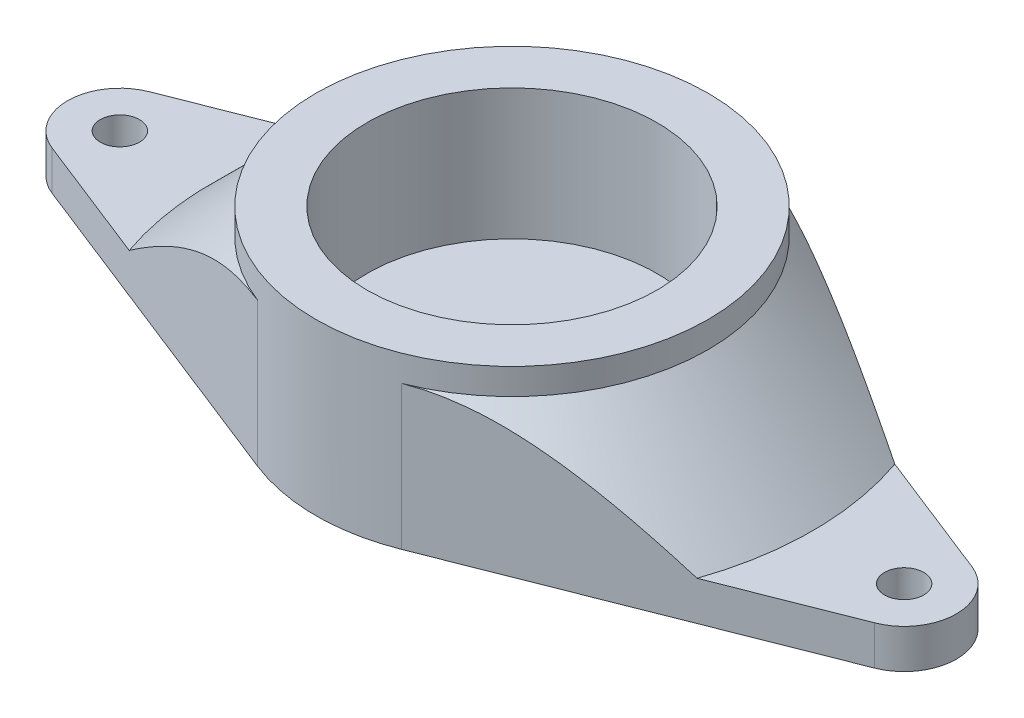
ISO-10303-21;
HEADER;
FILE_DESCRIPTION(('STEP AP214'),'2;1');
FILE_NAME('part.step','',(''),(''),'','','');
FILE_SCHEMA(('AUTOMOTIVE_DESIGN { 1 0 10303 214 1 1 1 1 }'));
ENDSEC;
DATA;
#1=APPLICATION_CONTEXT('core data for automotive mechanical design processes');
#2=APPLICATION_PROTOCOL_DEFINITION('international standard','automotive_design',2000,#1);
#3=PRODUCT_CONTEXT('',#1,'mechanical');
#4=PRODUCT('Part','Part','',(#3));
#5=PRODUCT_RELATED_PRODUCT_CATEGORY('part','',(#4));
#6=PRODUCT_DEFINITION_FORMATION('','',#4);
#7=PRODUCT_DEFINITION_CONTEXT('part definition',#1,'design');
#8=PRODUCT_DEFINITION('design','',#6,#7);
#9=PRODUCT_DEFINITION_SHAPE('','',#8);
#10=(LENGTH_UNIT() NAMED_UNIT(*) SI_UNIT(.MILLI.,.METRE.));
#11=(NAMED_UNIT(*) PLANE_ANGLE_UNIT() SI_UNIT($,.RADIAN.));
#12=(NAMED_UNIT(*) SI_UNIT($,.STERADIAN.) SOLID_ANGLE_UNIT());
#13=UNCERTAINTY_MEASURE_WITH_UNIT(LENGTH_MEASURE(1.E-05),#10,'distance_accuracy_value','');
#14=(GEOMETRIC_REPRESENTATION_CONTEXT(3) GLOBAL_UNCERTAINTY_ASSIGNED_CONTEXT((#13)) GLOBAL_UNIT_ASSIGNED_CONTEXT((#10,
#11,#12)) REPRESENTATION_CONTEXT('',''));
#15=CARTESIAN_POINT('',(0.,0.,0.));
#16=DIRECTION('',(0.,0.,1.));
#17=DIRECTION('',(1.,0.,0.));
#18=AXIS2_PLACEMENT_3D('',#15,#16,#17);
#19=CARTESIAN_POINT('',(0.,3.,0.));
#20=DIRECTION('',(0.,1.,0.));
#21=DIRECTION('',(0.,0.,1.));
#22=AXIS2_PLACEMENT_3D('',#19,#20,#21);
#23=PLANE('',#22);
#24=DIRECTION('',(-0.930352382463524,0.,-0.366666666666667));
#25=VECTOR('',#24,1.);
#26=CARTESIAN_POINT('',(5.5,3.,-13.9552857369529));
#27=LINE('',#26,#25);
#28=CARTESIAN_POINT('',(31.4666666666667,3.,-3.7214095298541));
#29=VERTEX_POINT('',#28);
#30=CARTESIAN_POINT('',(21.7212480681632,3.,-7.56223395309323));
#31=VERTEX_POINT('',#30);
#32=EDGE_CURVE('E155',#29,#31,#27,.T.);
#33=ORIENTED_EDGE('',*,*,#32,.T.);
#34=CARTESIAN_POINT('',(0.,3.,0.));
#35=DIRECTION('',(0.,1.,0.));
#36=DIRECTION('',(0.,0.,1.));
#37=AXIS2_PLACEMENT_3D('',#34,#35,#36);
#38=CIRCLE('',#37,23.);
#39=CARTESIAN_POINT('',(21.7212480681632,3.,7.56223395309322));
#40=VERTEX_POINT('',#39);
#41=EDGE_CURVE('E159',#31,#40,#38,.F.);
#42=ORIENTED_EDGE('',*,*,#41,.T.);
#43=DIRECTION('',(-0.930352382463524,0.,0.366666666666667));
#44=VECTOR('',#43,1.);
#45=CARTESIAN_POINT('',(5.5,3.,13.9552857369529));
#46=LINE('',#45,#44);
#47=CARTESIAN_POINT('',(31.4666666666667,3.,3.7214095298541));
#48=VERTEX_POINT('',#47);
#49=EDGE_CURVE('E139',#48,#40,#46,.T.);
#50=ORIENTED_EDGE('',*,*,#49,.F.);
#51=CARTESIAN_POINT('',(30.,3.,0.));
#52=DIRECTION('',(0.,1.,0.));
#53=DIRECTION('',(0.,0.,1.));
#54=AXIS2_PLACEMENT_3D('',#51,#52,#53);
#55=CIRCLE('',#54,4.00000000000001);
#56=EDGE_CURVE('E149',#48,#29,#55,.T.);
#57=ORIENTED_EDGE('',*,*,#56,.T.);
#58=EDGE_LOOP('',(#33,#42,#50,#57));
#59=FACE_BOUND('',#58,.T.);
#60=CARTESIAN_POINT('',(30.,3.,0.));
#61=DIRECTION('',(0.,1.,0.));
#62=DIRECTION('',(0.,0.,1.));
#63=AXIS2_PLACEMENT_3D('',#60,#61,#62);
#64=CIRCLE('',#63,1.5);
#65=CARTESIAN_POINT('',(30.,3.,1.5));
#66=VERTEX_POINT('',#65);
#67=EDGE_CURVE('E176',#66,#66,#64,.T.);
#68=ORIENTED_EDGE('',*,*,#67,.F.);
#69=EDGE_LOOP('',(#68));
#70=FACE_BOUND('',#69,.T.);
#71=ADVANCED_FACE('F49',(#59,#70),#23,.T.);
#72=CARTESIAN_POINT('',(5.5,3.,13.9552857369529));
#73=DIRECTION('',(0.366666666666667,0.,0.930352382463524));
#74=DIRECTION('',(0.930352382463524,0.,-0.366666666666667));
#75=AXIS2_PLACEMENT_3D('',#72,#73,#74);
#76=PLANE('',#75);
#77=DIRECTION('',(-0.930352382463524,0.,0.366666666666667));
#78=VECTOR('',#77,1.);
#79=CARTESIAN_POINT('',(5.5,0.,13.9552857369529));
#80=LINE('',#79,#78);
#81=CARTESIAN_POINT('',(31.4666666666667,0.,3.7214095298541));
#82=VERTEX_POINT('',#81);
#83=CARTESIAN_POINT('',(5.5,0.,13.9552857369529));
#84=VERTEX_POINT('',#83);
#85=EDGE_CURVE('E142',#82,#84,#80,.T.);
#86=ORIENTED_EDGE('',*,*,#85,.F.);
#87=DIRECTION('',(0.,-1.,0.));
#88=VECTOR('',#87,1.);
#89=CARTESIAN_POINT('',(31.4666666666667,3.,3.7214095298541));
#90=LINE('',#89,#88);
#91=EDGE_CURVE('E134',#48,#82,#90,.T.);
#92=ORIENTED_EDGE('',*,*,#91,.F.);
#93=ORIENTED_EDGE('',*,*,#49,.T.);
#94=CARTESIAN_POINT('',(21.7212480681632,3.,7.56223395309322));
#95=CARTESIAN_POINT('',(21.5075643523735,3.17410985062112,7.64645010308801));
#96=CARTESIAN_POINT('',(21.2932293106677,3.34729539153747,7.7309229509825));
#97=CARTESIAN_POINT('',(20.8631383891154,3.69162711219761,7.90042862167427));
#98=CARTESIAN_POINT('',(20.6473824753018,3.86277324291084,7.98546145785852));
#99=CARTESIAN_POINT('',(19.9976731790487,4.37297044073806,8.24152222198392));
#100=CARTESIAN_POINT('',(19.5614245288241,4.70866072440908,8.41345475145423));
#101=CARTESIAN_POINT('',(18.677714423066,5.37214300019925,8.76173895525231));
#102=CARTESIAN_POINT('',(18.2301865358051,5.69983303153375,8.93811681138016));
#103=CARTESIAN_POINT('',(17.3266519081969,6.34135500847636,9.29421417445213));
#104=CARTESIAN_POINT('',(16.8706461692404,6.65518857619453,9.47393328673225));
#105=CARTESIAN_POINT('',(15.9694573284899,7.25177506513842,9.8291061379053));
#106=CARTESIAN_POINT('',(15.5247136498744,7.53529138326098,10.0043866931366));
#107=CARTESIAN_POINT('',(14.6246769779185,8.08260356874915,10.3591054562681));
#108=CARTESIAN_POINT('',(14.1693822464693,8.34639615627377,10.5385443491844));
#109=CARTESIAN_POINT('',(13.2485058711978,8.84821524793771,10.9014763707469));
#110=CARTESIAN_POINT('',(12.7829641810053,9.08632579617666,11.0849537530321));
#111=CARTESIAN_POINT('',(11.839209759345,9.53124278959969,11.4569023764406));
#112=CARTESIAN_POINT('',(11.3610033008428,9.73806440389238,11.6453711452883));
#113=CARTESIAN_POINT('',(10.4493473228451,10.0903268181002,12.0046692616795));
#114=CARTESIAN_POINT('',(10.0173733514279,10.24014831646,12.1749170722638));
#115=CARTESIAN_POINT('',(9.14394222036088,10.5036047715038,12.5191501686989));
#116=CARTESIAN_POINT('',(8.70248870745209,10.617253386668,12.6931340173111));
#117=CARTESIAN_POINT('',(8.03061515790435,10.757249617318,12.9579300660748));
#118=CARTESIAN_POINT('',(7.80292924175071,10.7990716321909,13.04766470587));
#119=CARTESIAN_POINT('',(7.34598510173238,10.8712858390409,13.2277536569293));
#120=CARTESIAN_POINT('',(7.11672695024202,10.9016785535916,13.3181079396695));
#121=CARTESIAN_POINT('',(6.65653646075559,10.9505916651413,13.4994763286716));
#122=CARTESIAN_POINT('',(6.42560137332481,10.9690822633662,13.5904915185295));
#123=CARTESIAN_POINT('',(5.96311499147052,10.9938059090921,13.7727647552188));
#124=CARTESIAN_POINT('',(5.73156357296831,11.000036266414,13.8640228509517));
#125=CARTESIAN_POINT('',(5.5,11.,13.9552857369529));
#126=B_SPLINE_CURVE_WITH_KNOTS('',3,(#94,#95,#96,#97,#98,#99,#100,#101,#102,#103,#104,#105,#106,
#107,#108,#109,#110,#111,#112,#113,#114,#115,#116,#117,#118,#119,#120,#121,#122,#123,#124,#125),
.UNSPECIFIED.,.F.,.F.,(4,2,2,2,2,2,2,2,2,2,2,2,2,2,2,4),(0.,0.864637707240784,1.72929615993328,
3.45920562130299,5.20513869727487,6.95086684032179,8.61786242054814,10.2851345902588,
11.9467735761346,13.6076043875331,15.0700831415961,16.532009022962,17.2766191589124,
18.0211952454467,18.7676283152868,19.5142251514662),.UNSPECIFIED.);
#127=CARTESIAN_POINT('',(5.5,11.,13.9552857369529));
#128=VERTEX_POINT('',#127);
#129=EDGE_CURVE('E232',#40,#128,#126,.T.);
#130=ORIENTED_EDGE('',*,*,#129,.T.);
#131=DIRECTION('',(0.,-1.,0.));
#132=VECTOR('',#131,1.);
#133=CARTESIAN_POINT('',(5.5,3.,13.9552857369529));
#134=LINE('',#133,#132);
#135=EDGE_CURVE('E182',#128,#84,#134,.T.);
#136=ORIENTED_EDGE('',*,*,#135,.T.);
#137=EDGE_LOOP('',(#86,#92,#93,#130,#136));
#138=FACE_BOUND('',#137,.T.);
#139=ADVANCED_FACE('F136',(#138),#76,.T.);
#140=CARTESIAN_POINT('',(30.,3.,0.));
#141=DIRECTION('',(0.,-1.,0.));
#142=DIRECTION('',(0.,0.,-1.));
#143=AXIS2_PLACEMENT_3D('',#140,#141,#142);
#144=CYLINDRICAL_SURFACE('',#143,4.00000000000001);
#145=CARTESIAN_POINT('',(30.,0.,0.));
#146=DIRECTION('',(0.,1.,0.));
#147=DIRECTION('',(0.,0.,1.));
#148=AXIS2_PLACEMENT_3D('',#145,#146,#147);
#149=CIRCLE('',#148,4.00000000000001);
#150=CARTESIAN_POINT('',(31.4666666666667,0.,-3.7214095298541));
#151=VERTEX_POINT('',#150);
#152=EDGE_CURVE('E184',#82,#151,#149,.T.);
#153=ORIENTED_EDGE('',*,*,#152,.T.);
#154=DIRECTION('',(0.,-1.,0.));
#155=VECTOR('',#154,1.);
#156=CARTESIAN_POINT('',(31.4666666666667,3.,-3.7214095298541));
#157=LINE('',#156,#155);
#158=EDGE_CURVE('E146',#29,#151,#157,.T.);
#159=ORIENTED_EDGE('',*,*,#158,.F.);
#160=ORIENTED_EDGE('',*,*,#56,.F.);
#161=ORIENTED_EDGE('',*,*,#91,.T.);
#162=EDGE_LOOP('',(#153,#159,#160,#161));
#163=FACE_BOUND('',#162,.T.);
#164=ADVANCED_FACE('F150',(#163),#144,.T.);
#165=CARTESIAN_POINT('',(5.5,3.,-13.9552857369529));
#166=DIRECTION('',(-0.366666666666667,0.,0.930352382463524));
#167=DIRECTION('',(0.930352382463524,0.,0.366666666666667));
#168=AXIS2_PLACEMENT_3D('',#165,#166,#167);
#169=PLANE('',#168);
#170=DIRECTION('',(-0.930352382463524,0.,-0.366666666666667));
#171=VECTOR('',#170,1.);
#172=CARTESIAN_POINT('',(5.5,0.,-13.9552857369529));
#173=LINE('',#172,#171);
#174=CARTESIAN_POINT('',(5.5,0.,-13.9552857369529));
#175=VERTEX_POINT('',#174);
#176=EDGE_CURVE('E186',#151,#175,#173,.T.);
#177=ORIENTED_EDGE('',*,*,#176,.T.);
#178=DIRECTION('',(0.,-1.,0.));
#179=VECTOR('',#178,1.);
#180=CARTESIAN_POINT('',(5.5,3.,-13.9552857369529));
#181=LINE('',#180,#179);
#182=CARTESIAN_POINT('',(5.5,11.,-13.9552857369529));
#183=VERTEX_POINT('',#182);
#184=EDGE_CURVE('E214',#183,#175,#181,.T.);
#185=ORIENTED_EDGE('',*,*,#184,.F.);
#186=CARTESIAN_POINT('',(5.5,11.,-13.9552857369529));
#187=CARTESIAN_POINT('',(5.71447117709284,11.0000268126524,-13.8707592359378));
#188=CARTESIAN_POINT('',(5.92893377976381,10.9946864464169,-13.7862361142386));
#189=CARTESIAN_POINT('',(6.35737336801329,10.9734706453358,-13.6173812602579));
#190=CARTESIAN_POINT('',(6.57135042766842,10.9575969435526,-13.5330494987816));
#191=CARTESIAN_POINT('',(6.99798917230464,10.9155562210673,-13.3649043859025));
#192=CARTESIAN_POINT('',(7.21065264289511,10.8894100959428,-13.2810903307628));
#193=CARTESIAN_POINT('',(7.63471223333605,10.8272012198139,-13.1139617035611));
#194=CARTESIAN_POINT('',(7.84610830933945,10.7911381277199,-13.0306471487799));
#195=CARTESIAN_POINT('',(8.47106521489112,10.6700728745947,-12.7843416953965));
#196=CARTESIAN_POINT('',(8.88239666705259,10.5714737230664,-12.6222294298699));
#197=CARTESIAN_POINT('',(9.69722857874925,10.3419634877936,-12.3010912175247));
#198=CARTESIAN_POINT('',(10.1007251537097,10.2110367959331,-12.1420668016788));
#199=CARTESIAN_POINT('',(10.9382814836878,9.90739780062422,-11.8119725347673));
#200=CARTESIAN_POINT('',(11.3714429156239,9.73184187249781,-11.6412567271117));
#201=CARTESIAN_POINT('',(12.227364958779,9.35334288244665,-11.3039242406197));
#202=CARTESIAN_POINT('',(12.6501212667143,9.1503887071004,-11.1373092577758));
#203=CARTESIAN_POINT('',(13.48633768861,8.72191274751735,-10.8077430699443));
#204=CARTESIAN_POINT('',(13.8997825689238,8.49635686675049,-10.6447978687791));
#205=CARTESIAN_POINT('',(14.7175739683435,8.02716651722524,-10.3224932752659));
#206=CARTESIAN_POINT('',(15.1219215893882,7.78353425356746,-10.1631334486264));
#207=CARTESIAN_POINT('',(15.9268778223519,7.27883119264016,-9.84588739829461));
#208=CARTESIAN_POINT('',(16.3273996428863,7.01760121391017,-9.68803538046698));
#209=CARTESIAN_POINT('',(17.1212469199672,6.48281875315806,-9.37516754628257));
#210=CARTESIAN_POINT('',(17.5145721613783,6.20926590359814,-9.22015181471406));
#211=CARTESIAN_POINT('',(18.2946088492499,5.65223964337863,-8.91272695332742));
#212=CARTESIAN_POINT('',(18.6813254632668,5.36877456666087,-8.76031578689312));
#213=CARTESIAN_POINT('',(19.4492729804592,4.79343065959678,-8.45765545989071));
#214=CARTESIAN_POINT('',(19.8305040799292,4.50155213144676,-8.30740622195984));
#215=CARTESIAN_POINT('',(20.3367098843249,4.10682751983742,-8.10790246570178));
#216=CARTESIAN_POINT('',(20.463807472533,4.00711074227214,-8.0578112853189));
#217=CARTESIAN_POINT('',(20.7174874775998,3.80691996444148,-7.95783196177319));
#218=CARTESIAN_POINT('',(20.8440698906565,3.70644595860315,-7.90794382010882));
#219=CARTESIAN_POINT('',(21.0960202658067,3.50535958108494,-7.80864617121463));
#220=CARTESIAN_POINT('',(21.2213910359627,3.40475127170018,-7.75923555728273));
#221=CARTESIAN_POINT('',(21.4716648013732,3.20286715552121,-7.6605986869453));
#222=CARTESIAN_POINT('',(21.5965678008453,3.10159135476825,-7.61137242887754));
#223=CARTESIAN_POINT('',(21.7212480681632,3.,-7.56223395309323));
#224=B_SPLINE_CURVE_WITH_KNOTS('',3,(#186,#187,#188,#189,#190,#191,#192,#193,#194,#195,#196,
#197,#198,#199,#200,#201,#202,#203,#204,#205,#206,#207,#208,#209,#210,#211,#212,#213,#214,#215,
#216,#217,#218,#219,#220,#221,#222,#223),.UNSPECIFIED.,.F.,.F.,(4,2,2,2,2,2,2,2,2,2,2,2,2,2,2,2,
2,2,4),(0.,0.691503319128045,1.38289289257644,2.07288330230357,2.76289744690958,
4.12031731719285,5.47839385166097,6.97007342027112,8.46235988010185,9.95693247461534,
11.4513230481201,12.9617626425455,14.4722473166974,15.9814911873491,17.4906809160102,
17.9980820736511,18.5054869692455,19.0099960190077,19.5145005088749),.UNSPECIFIED.);
#225=EDGE_CURVE('E225',#183,#31,#224,.T.);
#226=ORIENTED_EDGE('',*,*,#225,.T.);
#227=ORIENTED_EDGE('',*,*,#32,.F.);
#228=ORIENTED_EDGE('',*,*,#158,.T.);
#229=EDGE_LOOP('',(#177,#185,#226,#227,#228));
#230=FACE_BOUND('',#229,.T.);
#231=ADVANCED_FACE('F238',(#230),#169,.F.);
#232=CARTESIAN_POINT('',(-5.5,3.,-13.9552857369529));
#233=DIRECTION('',(-0.366666666666667,0.,-0.930352382463524));
#234=DIRECTION('',(-0.930352382463524,0.,0.366666666666667));
#235=AXIS2_PLACEMENT_3D('',#232,#233,#234);
#236=PLANE('',#235);
#237=DIRECTION('',(0.930352382463524,0.,-0.366666666666667));
#238=VECTOR('',#237,1.);
#239=CARTESIAN_POINT('',(-5.5,0.,-13.9552857369529));
#240=LINE('',#239,#238);
#241=CARTESIAN_POINT('',(-31.4666666666667,0.,-3.72140952985409));
#242=VERTEX_POINT('',#241);
#243=CARTESIAN_POINT('',(-5.5,0.,-13.9552857369529));
#244=VERTEX_POINT('',#243);
#245=EDGE_CURVE('E191',#242,#244,#240,.T.);
#246=ORIENTED_EDGE('',*,*,#245,.F.);
#247=DIRECTION('',(0.,-1.,0.));
#248=VECTOR('',#247,1.);
#249=CARTESIAN_POINT('',(-31.4666666666667,3.,-3.72140952985409));
#250=LINE('',#249,#248);
#251=CARTESIAN_POINT('',(-31.4666666666667,3.,-3.72140952985409));
#252=VERTEX_POINT('',#251);
#253=EDGE_CURVE('E210',#252,#242,#250,.T.);
#254=ORIENTED_EDGE('',*,*,#253,.F.);
#255=DIRECTION('',(0.930352382463524,0.,-0.366666666666667));
#256=VECTOR('',#255,1.);
#257=CARTESIAN_POINT('',(-5.5,3.,-13.9552857369529));
#258=LINE('',#257,#256);
#259=CARTESIAN_POINT('',(-21.7212480681632,3.,-7.56223395309322));
#260=VERTEX_POINT('',#259);
#261=EDGE_CURVE('E170',#252,#260,#258,.T.);
#262=ORIENTED_EDGE('',*,*,#261,.T.);
#263=CARTESIAN_POINT('',(-21.7212480681632,3.,-7.56223395309322));
#264=CARTESIAN_POINT('',(-21.5075643523735,3.17410985062112,-7.64645010308801));
#265=CARTESIAN_POINT('',(-21.2932293106677,3.34729539153747,-7.7309229509825));
#266=CARTESIAN_POINT('',(-20.8631383891154,3.69162711219761,-7.90042862167427));
#267=CARTESIAN_POINT('',(-20.6473824753018,3.86277324291084,-7.98546145785852));
#268=CARTESIAN_POINT('',(-19.9976731790487,4.37297044073806,-8.24152222198392));
#269=CARTESIAN_POINT('',(-19.5614245288241,4.70866072440908,-8.41345475145423));
#270=CARTESIAN_POINT('',(-18.677714423066,5.37214300019925,-8.76173895525231));
#271=CARTESIAN_POINT('',(-18.2301865358051,5.69983303153375,-8.93811681138016));
#272=CARTESIAN_POINT('',(-17.3266519081969,6.34135500847636,-9.29421417445213));
#273=CARTESIAN_POINT('',(-16.8706461692404,6.65518857619453,-9.47393328673225));
#274=CARTESIAN_POINT('',(-15.9694573284899,7.25177506513842,-9.8291061379053));
#275=CARTESIAN_POINT('',(-15.5247136498744,7.53529138326098,-10.0043866931366));
#276=CARTESIAN_POINT('',(-14.6246769779185,8.08260356874915,-10.3591054562681));
#277=CARTESIAN_POINT('',(-14.1693822464693,8.34639615627377,-10.5385443491844));
#278=CARTESIAN_POINT('',(-13.2485058711978,8.84821524793771,-10.9014763707469));
#279=CARTESIAN_POINT('',(-12.7829641810053,9.08632579617666,-11.0849537530321));
#280=CARTESIAN_POINT('',(-11.839209759345,9.53124278959969,-11.4569023764406));
#281=CARTESIAN_POINT('',(-11.3610033008428,9.73806440389238,-11.6453711452883));
#282=CARTESIAN_POINT('',(-10.4493473228451,10.0903268181002,-12.0046692616795));
#283=CARTESIAN_POINT('',(-10.0173733514279,10.24014831646,-12.1749170722638));
#284=CARTESIAN_POINT('',(-9.14394222036088,10.5036047715038,-12.5191501686989));
#285=CARTESIAN_POINT('',(-8.70248870745209,10.617253386668,-12.6931340173111));
#286=CARTESIAN_POINT('',(-8.03061515790435,10.757249617318,-12.9579300660748));
#287=CARTESIAN_POINT('',(-7.80292924175071,10.7990716321909,-13.04766470587));
#288=CARTESIAN_POINT('',(-7.34598510173238,10.8712858390409,-13.2277536569293));
#289=CARTESIAN_POINT('',(-7.11672695024202,10.9016785535916,-13.3181079396695));
#290=CARTESIAN_POINT('',(-6.65653646075559,10.9505916651413,-13.4994763286716));
#291=CARTESIAN_POINT('',(-6.42560137332481,10.9690822633662,-13.5904915185295));
#292=CARTESIAN_POINT('',(-5.96311499147052,10.9938059090921,-13.7727647552188));
#293=CARTESIAN_POINT('',(-5.73156357296831,11.000036266414,-13.8640228509517));
#294=CARTESIAN_POINT('',(-5.5,11.,-13.9552857369529));
#295=B_SPLINE_CURVE_WITH_KNOTS('',3,(#263,#264,#265,#266,#267,#268,#269,#270,#271,#272,#273,
#274,#275,#276,#277,#278,#279,#280,#281,#282,#283,#284,#285,#286,#287,#288,#289,#290,#291,#292,
#293,#294),.UNSPECIFIED.,.F.,.F.,(4,2,2,2,2,2,2,2,2,2,2,2,2,2,2,4),(0.,0.864637707240784,
1.72929615993328,3.45920562130299,5.20513869727487,6.95086684032179,8.61786242054814,
10.2851345902588,11.9467735761346,13.6076043875331,15.0700831415961,16.532009022962,
17.2766191589124,18.0211952454467,18.7676283152868,19.5142251514662),.UNSPECIFIED.);
#296=CARTESIAN_POINT('',(-5.5,11.,-13.9552857369529));
#297=VERTEX_POINT('',#296);
#298=EDGE_CURVE('E12',#260,#297,#295,.T.);
#299=ORIENTED_EDGE('',*,*,#298,.T.);
#300=DIRECTION('',(0.,-1.,0.));
#301=VECTOR('',#300,1.);
#302=CARTESIAN_POINT('',(-5.5,3.,-13.9552857369529));
#303=LINE('',#302,#301);
#304=EDGE_CURVE('E212',#297,#244,#303,.T.);
#305=ORIENTED_EDGE('',*,*,#304,.T.);
#306=EDGE_LOOP('',(#246,#254,#262,#299,#305));
#307=FACE_BOUND('',#306,.T.);
#308=ADVANCED_FACE('F257',(#307),#236,.T.);
#309=CARTESIAN_POINT('',(-30.,3.,0.));
#310=DIRECTION('',(0.,-1.,0.));
#311=DIRECTION('',(0.,0.,-1.));
#312=AXIS2_PLACEMENT_3D('',#309,#310,#311);
#313=CYLINDRICAL_SURFACE('',#312,4.);
#314=CARTESIAN_POINT('',(-30.,0.,0.));
#315=DIRECTION('',(0.,1.,0.));
#316=DIRECTION('',(0.,0.,1.));
#317=AXIS2_PLACEMENT_3D('',#314,#315,#316);
#318=CIRCLE('',#317,4.);
#319=CARTESIAN_POINT('',(-31.4666666666667,0.,3.7214095298541));
#320=VERTEX_POINT('',#319);
#321=EDGE_CURVE('E194',#242,#320,#318,.T.);
#322=ORIENTED_EDGE('',*,*,#321,.T.);
#323=DIRECTION('',(0.,-1.,0.));
#324=VECTOR('',#323,1.);
#325=CARTESIAN_POINT('',(-31.4666666666667,3.,3.7214095298541));
#326=LINE('',#325,#324);
#327=CARTESIAN_POINT('',(-31.4666666666667,3.,3.7214095298541));
#328=VERTEX_POINT('',#327);
#329=EDGE_CURVE('E207',#328,#320,#326,.T.);
#330=ORIENTED_EDGE('',*,*,#329,.F.);
#331=CARTESIAN_POINT('',(-30.,3.,0.));
#332=DIRECTION('',(0.,1.,0.));
#333=DIRECTION('',(0.,0.,1.));
#334=AXIS2_PLACEMENT_3D('',#331,#332,#333);
#335=CIRCLE('',#334,4.);
#336=EDGE_CURVE('E172',#252,#328,#335,.T.);
#337=ORIENTED_EDGE('',*,*,#336,.F.);
#338=ORIENTED_EDGE('',*,*,#253,.T.);
#339=EDGE_LOOP('',(#322,#330,#337,#338));
#340=FACE_BOUND('',#339,.T.);
#341=ADVANCED_FACE('F296',(#340),#313,.T.);
#342=CARTESIAN_POINT('',(-5.5,3.,13.9552857369529));
#343=DIRECTION('',(0.366666666666666,0.,-0.930352382463524));
#344=DIRECTION('',(-0.930352382463524,0.,-0.366666666666666));
#345=AXIS2_PLACEMENT_3D('',#342,#343,#344);
#346=PLANE('',#345);
#347=DIRECTION('',(0.930352382463524,0.,0.366666666666666));
#348=VECTOR('',#347,1.);
#349=CARTESIAN_POINT('',(-5.5,0.,13.9552857369529));
#350=LINE('',#349,#348);
#351=CARTESIAN_POINT('',(-5.5,0.,13.9552857369529));
#352=VERTEX_POINT('',#351);
#353=EDGE_CURVE('E196',#320,#352,#350,.T.);
#354=ORIENTED_EDGE('',*,*,#353,.T.);
#355=DIRECTION('',(0.,-1.,0.));
#356=VECTOR('',#355,1.);
#357=CARTESIAN_POINT('',(-5.5,3.,13.9552857369529));
#358=LINE('',#357,#356);
#359=CARTESIAN_POINT('',(-5.5,11.,13.9552857369529));
#360=VERTEX_POINT('',#359);
#361=EDGE_CURVE('E204',#360,#352,#358,.T.);
#362=ORIENTED_EDGE('',*,*,#361,.F.);
#363=CARTESIAN_POINT('',(-5.5,11.,13.9552857369529));
#364=CARTESIAN_POINT('',(-5.71447117709284,11.0000268126524,13.8707592359378));
#365=CARTESIAN_POINT('',(-5.92893377976382,10.9946864464169,13.7862361142386));
#366=CARTESIAN_POINT('',(-6.35737336801329,10.9734706453358,13.6173812602579));
#367=CARTESIAN_POINT('',(-6.57135042766842,10.9575969435526,13.5330494987816));
#368=CARTESIAN_POINT('',(-6.99798917230464,10.9155562210673,13.3649043859025));
#369=CARTESIAN_POINT('',(-7.21065264289512,10.8894100959428,13.2810903307628));
#370=CARTESIAN_POINT('',(-7.63471223333605,10.8272012198139,13.1139617035611));
#371=CARTESIAN_POINT('',(-7.84610830933945,10.7911381277199,13.0306471487799));
#372=CARTESIAN_POINT('',(-8.47106521489112,10.6700728745947,12.7843416953965));
#373=CARTESIAN_POINT('',(-8.88239666705259,10.5714737230664,12.6222294298699));
#374=CARTESIAN_POINT('',(-9.69722857874925,10.3419634877936,12.3010912175247));
#375=CARTESIAN_POINT('',(-10.1007251537097,10.2110367959331,12.1420668016788));
#376=CARTESIAN_POINT('',(-10.9382814836878,9.90739780062422,11.8119725347673));
#377=CARTESIAN_POINT('',(-11.3714429156239,9.7318418724978,11.6412567271117));
#378=CARTESIAN_POINT('',(-12.227364958779,9.35334288244665,11.3039242406197));
#379=CARTESIAN_POINT('',(-12.6501212667143,9.1503887071004,11.1373092577758));
#380=CARTESIAN_POINT('',(-13.48633768861,8.72191274751735,10.8077430699443));
#381=CARTESIAN_POINT('',(-13.8997825689239,8.49635686675049,10.6447978687791));
#382=CARTESIAN_POINT('',(-14.7175739683435,8.02716651722524,10.3224932752659));
#383=CARTESIAN_POINT('',(-15.1219215893882,7.78353425356746,10.1631334486264));
#384=CARTESIAN_POINT('',(-15.9268778223519,7.27883119264016,9.8458873982946));
#385=CARTESIAN_POINT('',(-16.3273996428863,7.01760121391017,9.68803538046698));
#386=CARTESIAN_POINT('',(-17.1212469199672,6.48281875315805,9.37516754628257));
#387=CARTESIAN_POINT('',(-17.5145721613783,6.20926590359814,9.22015181471405));
#388=CARTESIAN_POINT('',(-18.2946088492499,5.65223964337862,8.91272695332742));
#389=CARTESIAN_POINT('',(-18.6813254632668,5.36877456666087,8.76031578689312));
#390=CARTESIAN_POINT('',(-19.4492729804592,4.79343065959678,8.45765545989071));
#391=CARTESIAN_POINT('',(-19.8305040799292,4.50155213144676,8.30740622195984));
#392=CARTESIAN_POINT('',(-20.3367098843249,4.10682751983742,8.10790246570178));
#393=CARTESIAN_POINT('',(-20.463807472533,4.00711074227214,8.05781128531889));
#394=CARTESIAN_POINT('',(-20.7174874775998,3.80691996444147,7.95783196177318));
#395=CARTESIAN_POINT('',(-20.8440698906565,3.70644595860315,7.90794382010882));
#396=CARTESIAN_POINT('',(-21.0960202658067,3.50535958108495,7.80864617121462));
#397=CARTESIAN_POINT('',(-21.2213910359627,3.40475127170018,7.75923555728272));
#398=CARTESIAN_POINT('',(-21.4716648013732,3.20286715552121,7.6605986869453));
#399=CARTESIAN_POINT('',(-21.5965678008453,3.10159135476825,7.61137242887754));
#400=CARTESIAN_POINT('',(-21.7212480681632,3.,7.56223395309323));
#401=B_SPLINE_CURVE_WITH_KNOTS('',3,(#363,#364,#365,#366,#367,#368,#369,#370,#371,#372,#373,
#374,#375,#376,#377,#378,#379,#380,#381,#382,#383,#384,#385,#386,#387,#388,#389,#390,#391,#392,
#393,#394,#395,#396,#397,#398,#399,#400),.UNSPECIFIED.,.F.,.F.,(4,2,2,2,2,2,2,2,2,2,2,2,2,2,2,2,
2,2,4),(0.,0.691503319128047,1.38289289257645,2.07288330230357,2.76289744690958,
4.12031731719285,5.47839385166097,6.97007342027113,8.46235988010185,9.95693247461534,
11.4513230481201,12.9617626425455,14.4722473166974,15.9814911873491,17.4906809160102,
17.9980820736511,18.5054869692455,19.0099960190076,19.5145005088749),.UNSPECIFIED.);
#402=CARTESIAN_POINT('',(-21.7212480681632,3.,7.56223395309323));
#403=VERTEX_POINT('',#402);
#404=EDGE_CURVE('E64',#360,#403,#401,.T.);
#405=ORIENTED_EDGE('',*,*,#404,.T.);
#406=DIRECTION('',(0.930352382463524,0.,0.366666666666666));
#407=VECTOR('',#406,1.);
#408=CARTESIAN_POINT('',(-5.5,3.,13.9552857369529));
#409=LINE('',#408,#407);
#410=EDGE_CURVE('E174',#328,#403,#409,.T.);
#411=ORIENTED_EDGE('',*,*,#410,.F.);
#412=ORIENTED_EDGE('',*,*,#329,.T.);
#413=EDGE_LOOP('',(#354,#362,#405,#411,#412));
#414=FACE_BOUND('',#413,.T.);
#415=ADVANCED_FACE('F298',(#414),#346,.F.);
#416=CARTESIAN_POINT('',(30.,3.,0.));
#417=DIRECTION('',(0.,-1.,0.));
#418=DIRECTION('',(0.,0.,-1.));
#419=AXIS2_PLACEMENT_3D('',#416,#417,#418);
#420=CYLINDRICAL_SURFACE('',#419,1.5);
#421=ORIENTED_EDGE('',*,*,#67,.T.);
#422=EDGE_LOOP('',(#421));
#423=FACE_BOUND('',#422,.T.);
#424=CARTESIAN_POINT('',(30.,0.,0.));
#425=DIRECTION('',(0.,1.,0.));
#426=DIRECTION('',(0.,0.,1.));
#427=AXIS2_PLACEMENT_3D('',#424,#425,#426);
#428=CIRCLE('',#427,1.5);
#429=CARTESIAN_POINT('',(30.,0.,1.5));
#430=VERTEX_POINT('',#429);
#431=EDGE_CURVE('E163',#430,#430,#428,.T.);
#432=ORIENTED_EDGE('',*,*,#431,.F.);
#433=EDGE_LOOP('',(#432));
#434=FACE_BOUND('',#433,.T.);
#435=ADVANCED_FACE('F316',(#423,#434),#420,.F.);
#436=CARTESIAN_POINT('',(0.,3.,0.));
#437=DIRECTION('',(0.,-1.,0.));
#438=DIRECTION('',(0.,0.,-1.));
#439=AXIS2_PLACEMENT_3D('',#436,#437,#438);
#440=CYLINDRICAL_SURFACE('',#439,15.);
#441=CARTESIAN_POINT('',(0.,11.,0.));
#442=DIRECTION('',(0.,1.,0.));
#443=DIRECTION('',(0.,0.,1.));
#444=AXIS2_PLACEMENT_3D('',#441,#442,#443);
#445=CIRCLE('',#444,15.);
#446=EDGE_CURVE('E220',#128,#183,#445,.T.);
#447=ORIENTED_EDGE('',*,*,#446,.T.);
#448=ORIENTED_EDGE('',*,*,#184,.T.);
#449=CARTESIAN_POINT('',(0.,0.,0.));
#450=DIRECTION('',(0.,1.,0.));
#451=DIRECTION('',(0.,0.,1.));
#452=AXIS2_PLACEMENT_3D('',#449,#450,#451);
#453=CIRCLE('',#452,15.);
#454=EDGE_CURVE('E188',#175,#244,#453,.T.);
#455=ORIENTED_EDGE('',*,*,#454,.T.);
#456=ORIENTED_EDGE('',*,*,#304,.F.);
#457=CARTESIAN_POINT('',(0.,11.,0.));
#458=DIRECTION('',(0.,1.,0.));
#459=DIRECTION('',(0.,0.,1.));
#460=AXIS2_PLACEMENT_3D('',#457,#458,#459);
#461=CIRCLE('',#460,15.);
#462=EDGE_CURVE('E145',#297,#360,#461,.T.);
#463=ORIENTED_EDGE('',*,*,#462,.T.);
#464=ORIENTED_EDGE('',*,*,#361,.T.);
#465=CARTESIAN_POINT('',(0.,0.,0.));
#466=DIRECTION('',(0.,1.,0.));
#467=DIRECTION('',(0.,0.,1.));
#468=AXIS2_PLACEMENT_3D('',#465,#466,#467);
#469=CIRCLE('',#468,15.);
#470=EDGE_CURVE('E198',#352,#84,#469,.T.);
#471=ORIENTED_EDGE('',*,*,#470,.T.);
#472=ORIENTED_EDGE('',*,*,#135,.F.);
#473=EDGE_LOOP('',(#447,#448,#455,#456,#463,#464,#471,#472));
#474=FACE_BOUND('',#473,.T.);
#475=CARTESIAN_POINT('',(0.,13.,0.));
#476=DIRECTION('',(0.,1.,0.));
#477=DIRECTION('',(0.,0.,1.));
#478=AXIS2_PLACEMENT_3D('',#475,#476,#477);
#479=CIRCLE('',#478,15.);
#480=CARTESIAN_POINT('',(0.,13.,15.));
#481=VERTEX_POINT('',#480);
#482=EDGE_CURVE('E166',#481,#481,#479,.T.);
#483=ORIENTED_EDGE('',*,*,#482,.F.);
#484=EDGE_LOOP('',(#483));
#485=FACE_BOUND('',#484,.T.);
#486=ADVANCED_FACE('F279',(#474,#485),#440,.T.);
#487=CARTESIAN_POINT('',(-30.,3.,0.));
#488=DIRECTION('',(0.,-1.,0.));
#489=DIRECTION('',(0.,0.,-1.));
#490=AXIS2_PLACEMENT_3D('',#487,#488,#489);
#491=CYLINDRICAL_SURFACE('',#490,1.5);
#492=CARTESIAN_POINT('',(-30.,3.,0.));
#493=DIRECTION('',(0.,1.,0.));
#494=DIRECTION('',(0.,0.,1.));
#495=AXIS2_PLACEMENT_3D('',#492,#493,#494);
#496=CIRCLE('',#495,1.5);
#497=CARTESIAN_POINT('',(-30.,3.,1.5));
#498=VERTEX_POINT('',#497);
#499=EDGE_CURVE('E179',#498,#498,#496,.T.);
#500=ORIENTED_EDGE('',*,*,#499,.T.);
#501=EDGE_LOOP('',(#500));
#502=FACE_BOUND('',#501,.T.);
#503=CARTESIAN_POINT('',(-30.,0.,0.));
#504=DIRECTION('',(0.,1.,0.));
#505=DIRECTION('',(0.,0.,1.));
#506=AXIS2_PLACEMENT_3D('',#503,#504,#505);
#507=CIRCLE('',#506,1.5);
#508=CARTESIAN_POINT('',(-30.,0.,1.5));
#509=VERTEX_POINT('',#508);
#510=EDGE_CURVE('E160',#509,#509,#507,.T.);
#511=ORIENTED_EDGE('',*,*,#510,.F.);
#512=EDGE_LOOP('',(#511));
#513=FACE_BOUND('',#512,.T.);
#514=ADVANCED_FACE('F271',(#502,#513),#491,.F.);
#515=ORIENTED_EDGE('',*,*,#410,.T.);
#516=CARTESIAN_POINT('',(0.,3.,0.));
#517=DIRECTION('',(0.,1.,0.));
#518=DIRECTION('',(0.,0.,1.));
#519=AXIS2_PLACEMENT_3D('',#516,#517,#518);
#520=CIRCLE('',#519,23.);
#521=EDGE_CURVE('E77',#403,#260,#520,.F.);
#522=ORIENTED_EDGE('',*,*,#521,.T.);
#523=ORIENTED_EDGE('',*,*,#261,.F.);
#524=ORIENTED_EDGE('',*,*,#336,.T.);
#525=EDGE_LOOP('',(#515,#522,#523,#524));
#526=FACE_BOUND('',#525,.T.);
#527=ORIENTED_EDGE('',*,*,#499,.F.);
#528=EDGE_LOOP('',(#527));
#529=FACE_BOUND('',#528,.T.);
#530=ADVANCED_FACE('F261',(#526,#529),#23,.T.);
#531=CARTESIAN_POINT('',(0.,0.,0.));
#532=DIRECTION('',(0.,1.,0.));
#533=DIRECTION('',(0.,0.,1.));
#534=AXIS2_PLACEMENT_3D('',#531,#532,#533);
#535=PLANE('',#534);
#536=ORIENTED_EDGE('',*,*,#85,.T.);
#537=ORIENTED_EDGE('',*,*,#470,.F.);
#538=ORIENTED_EDGE('',*,*,#353,.F.);
#539=ORIENTED_EDGE('',*,*,#321,.F.);
#540=ORIENTED_EDGE('',*,*,#245,.T.);
#541=ORIENTED_EDGE('',*,*,#454,.F.);
#542=ORIENTED_EDGE('',*,*,#176,.F.);
#543=ORIENTED_EDGE('',*,*,#152,.F.);
#544=EDGE_LOOP('',(#536,#537,#538,#539,#540,#541,#542,#543));
#545=FACE_BOUND('',#544,.T.);
#546=ORIENTED_EDGE('',*,*,#431,.T.);
#547=EDGE_LOOP('',(#546));
#548=FACE_BOUND('',#547,.T.);
#549=ORIENTED_EDGE('',*,*,#510,.T.);
#550=EDGE_LOOP('',(#549));
#551=FACE_BOUND('',#550,.T.);
#552=ADVANCED_FACE('F270',(#545,#548,#551),#535,.F.);
#553=CARTESIAN_POINT('',(0.,13.,0.));
#554=DIRECTION('',(0.,1.,0.));
#555=DIRECTION('',(0.,0.,1.));
#556=AXIS2_PLACEMENT_3D('',#553,#554,#555);
#557=PLANE('',#556);
#558=ORIENTED_EDGE('',*,*,#482,.T.);
#559=EDGE_LOOP('',(#558));
#560=FACE_BOUND('',#559,.T.);
#561=CARTESIAN_POINT('',(0.,13.,0.));
#562=DIRECTION('',(0.,1.,0.));
#563=DIRECTION('',(0.,0.,1.));
#564=AXIS2_PLACEMENT_3D('',#561,#562,#563);
#565=CIRCLE('',#564,11.1);
#566=CARTESIAN_POINT('',(0.,13.,11.1));
#567=VERTEX_POINT('',#566);
#568=EDGE_CURVE('E520',#567,#567,#565,.T.);
#569=ORIENTED_EDGE('',*,*,#568,.F.);
#570=EDGE_LOOP('',(#569));
#571=FACE_BOUND('',#570,.T.);
#572=ADVANCED_FACE('F276',(#560,#571),#557,.T.);
#573=CARTESIAN_POINT('',(0.,13.,0.));
#574=DIRECTION('',(0.,-1.,0.));
#575=DIRECTION('',(0.,0.,-1.));
#576=AXIS2_PLACEMENT_3D('',#573,#574,#575);
#577=CYLINDRICAL_SURFACE('',#576,11.1);
#578=ORIENTED_EDGE('',*,*,#568,.T.);
#579=EDGE_LOOP('',(#578));
#580=FACE_BOUND('',#579,.T.);
#581=CARTESIAN_POINT('',(0.,3.,0.));
#582=DIRECTION('',(0.,1.,0.));
#583=DIRECTION('',(0.,0.,1.));
#584=AXIS2_PLACEMENT_3D('',#581,#582,#583);
#585=CIRCLE('',#584,11.1);
#586=CARTESIAN_POINT('',(0.,3.,11.1));
#587=VERTEX_POINT('',#586);
#588=EDGE_CURVE('E523',#587,#587,#585,.T.);
#589=ORIENTED_EDGE('',*,*,#588,.F.);
#590=EDGE_LOOP('',(#589));
#591=FACE_BOUND('',#590,.T.);
#592=ADVANCED_FACE('F267',(#580,#591),#577,.F.);
#593=ORIENTED_EDGE('',*,*,#588,.T.);
#594=EDGE_LOOP('',(#593));
#595=FACE_BOUND('',#594,.T.);
#596=ADVANCED_FACE('F247',(#595),#23,.T.);
#597=CARTESIAN_POINT('',(0.,11.,0.));
#598=DIRECTION('',(0.,-1.,0.));
#599=DIRECTION('',(0.,0.,-1.));
#600=AXIS2_PLACEMENT_3D('',#597,#598,#599);
#601=CONICAL_SURFACE('',#600,15.,0.785398163397443);
#602=ORIENTED_EDGE('',*,*,#129,.F.);
#603=ORIENTED_EDGE('',*,*,#41,.F.);
#604=ORIENTED_EDGE('',*,*,#225,.F.);
#605=ORIENTED_EDGE('',*,*,#446,.F.);
#606=EDGE_LOOP('',(#602,#603,#604,#605));
#607=FACE_BOUND('',#606,.T.);
#608=ADVANCED_FACE('F242',(#607),#601,.T.);
#609=CARTESIAN_POINT('',(0.,11.,0.));
#610=DIRECTION('',(0.,-1.,0.));
#611=DIRECTION('',(0.,0.,-1.));
#612=AXIS2_PLACEMENT_3D('',#609,#610,#611);
#613=CONICAL_SURFACE('',#612,15.,0.785398163397443);
#614=ORIENTED_EDGE('',*,*,#298,.F.);
#615=ORIENTED_EDGE('',*,*,#521,.F.);
#616=ORIENTED_EDGE('',*,*,#404,.F.);
#617=ORIENTED_EDGE('',*,*,#462,.F.);
#618=EDGE_LOOP('',(#614,#615,#616,#617));
#619=FACE_BOUND('',#618,.T.);
#620=ADVANCED_FACE('F52',(#619),#613,.T.);
#621=CLOSED_SHELL('',(#71,#139,#164,#231,#308,#341,#415,#435,#486,#514,#530,#552,#572,#592,#596,
#608,#620));
#622=MANIFOLD_SOLID_BREP('B2',#621);
#623=ADVANCED_BREP_SHAPE_REPRESENTATION('',(#18,#622),#14);
#624=SHAPE_DEFINITION_REPRESENTATION(#9,#623);
ENDSEC;
END-ISO-10303-21;
